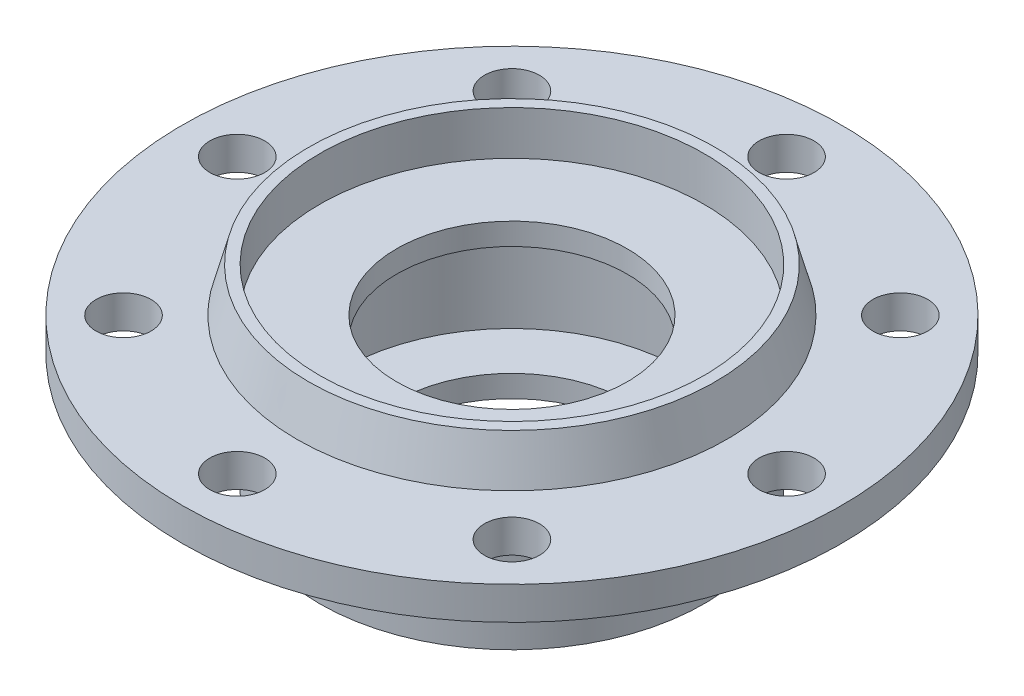
ISO-10303-21;
HEADER;
FILE_DESCRIPTION(('STEP AP214'),'2;1');
FILE_NAME('part.step','',(''),(''),'','','');
FILE_SCHEMA(('AUTOMOTIVE_DESIGN { 1 0 10303 214 1 1 1 1 }'));
ENDSEC;
DATA;
#1=APPLICATION_CONTEXT('core data for automotive mechanical design processes');
#2=APPLICATION_PROTOCOL_DEFINITION('international standard','automotive_design',2000,#1);
#3=PRODUCT_CONTEXT('',#1,'mechanical');
#4=PRODUCT('Part','Part','',(#3));
#5=PRODUCT_RELATED_PRODUCT_CATEGORY('part','',(#4));
#6=PRODUCT_DEFINITION_FORMATION('','',#4);
#7=PRODUCT_DEFINITION_CONTEXT('part definition',#1,'design');
#8=PRODUCT_DEFINITION('design','',#6,#7);
#9=PRODUCT_DEFINITION_SHAPE('','',#8);
#10=(LENGTH_UNIT() NAMED_UNIT(*) SI_UNIT(.MILLI.,.METRE.));
#11=(NAMED_UNIT(*) PLANE_ANGLE_UNIT() SI_UNIT($,.RADIAN.));
#12=(NAMED_UNIT(*) SI_UNIT($,.STERADIAN.) SOLID_ANGLE_UNIT());
#13=UNCERTAINTY_MEASURE_WITH_UNIT(LENGTH_MEASURE(1.E-05),#10,'distance_accuracy_value','');
#14=(GEOMETRIC_REPRESENTATION_CONTEXT(3) GLOBAL_UNCERTAINTY_ASSIGNED_CONTEXT((#13)) GLOBAL_UNIT_ASSIGNED_CONTEXT((#10,
#11,#12)) REPRESENTATION_CONTEXT('',''));
#15=CARTESIAN_POINT('',(0.,0.,0.));
#16=DIRECTION('',(0.,0.,1.));
#17=DIRECTION('',(1.,0.,0.));
#18=AXIS2_PLACEMENT_3D('',#15,#16,#17);
#19=CARTESIAN_POINT('',(-68.5279187817259,64.8477157360406,0.));
#20=DIRECTION('',(0.,1.,0.));
#21=DIRECTION('',(0.,0.,1.));
#22=AXIS2_PLACEMENT_3D('',#19,#20,#21);
#23=CYLINDRICAL_SURFACE('',#22,21.);
#24=CARTESIAN_POINT('',(-68.5279187817259,25.515656182297,0.));
#25=DIRECTION('',(0.,1.,0.));
#26=DIRECTION('',(0.,0.,1.));
#27=AXIS2_PLACEMENT_3D('',#24,#25,#26);
#28=CIRCLE('',#27,21.);
#29=CARTESIAN_POINT('',(-68.5279187817259,25.515656182297,21.));
#30=VERTEX_POINT('',#29);
#31=EDGE_CURVE('E86',#30,#30,#28,.T.);
#32=ORIENTED_EDGE('',*,*,#31,.F.);
#33=EDGE_LOOP('',(#32));
#34=FACE_BOUND('',#33,.T.);
#35=CARTESIAN_POINT('',(-68.5279187817259,29.5156561822969,0.));
#36=DIRECTION('',(0.,1.,0.));
#37=DIRECTION('',(0.,0.,1.));
#38=AXIS2_PLACEMENT_3D('',#35,#36,#37);
#39=CIRCLE('',#38,21.);
#40=CARTESIAN_POINT('',(-68.5279187817259,29.5156561822969,21.));
#41=VERTEX_POINT('',#40);
#42=EDGE_CURVE('E10',#41,#41,#39,.T.);
#43=ORIENTED_EDGE('',*,*,#42,.T.);
#44=EDGE_LOOP('',(#43));
#45=FACE_BOUND('',#44,.T.);
#46=ADVANCED_FACE('F37',(#34,#45),#23,.F.);
#47=CARTESIAN_POINT('',(-47.5279187817259,29.5156561822969,0.));
#48=DIRECTION('',(0.,-1.,0.));
#49=DIRECTION('',(0.,0.,-1.));
#50=AXIS2_PLACEMENT_3D('',#47,#48,#49);
#51=PLANE('',#50);
#52=ORIENTED_EDGE('',*,*,#42,.F.);
#53=EDGE_LOOP('',(#52));
#54=FACE_BOUND('',#53,.T.);
#55=CARTESIAN_POINT('',(-68.5279187817259,29.5156561822969,0.));
#56=DIRECTION('',(0.,1.,0.));
#57=DIRECTION('',(0.,0.,1.));
#58=AXIS2_PLACEMENT_3D('',#55,#56,#57);
#59=CIRCLE('',#58,31.);
#60=CARTESIAN_POINT('',(-68.5279187817259,29.5156561822969,31.));
#61=VERTEX_POINT('',#60);
#62=EDGE_CURVE('E45',#61,#61,#59,.T.);
#63=ORIENTED_EDGE('',*,*,#62,.T.);
#64=EDGE_LOOP('',(#63));
#65=FACE_BOUND('',#64,.T.);
#66=ADVANCED_FACE('F215',(#54,#65),#51,.F.);
#67=CARTESIAN_POINT('',(-68.5279187817259,64.8477157360406,0.));
#68=DIRECTION('',(0.,1.,0.));
#69=DIRECTION('',(0.,0.,1.));
#70=AXIS2_PLACEMENT_3D('',#67,#68,#69);
#71=CYLINDRICAL_SURFACE('',#70,31.);
#72=ORIENTED_EDGE('',*,*,#62,.F.);
#73=EDGE_LOOP('',(#72));
#74=FACE_BOUND('',#73,.T.);
#75=CARTESIAN_POINT('',(-68.5279187817259,49.5156561822969,0.));
#76=DIRECTION('',(0.,1.,0.));
#77=DIRECTION('',(0.,0.,1.));
#78=AXIS2_PLACEMENT_3D('',#75,#76,#77);
#79=CIRCLE('',#78,31.);
#80=CARTESIAN_POINT('',(-68.5279187817259,49.5156561822969,31.));
#81=VERTEX_POINT('',#80);
#82=EDGE_CURVE('E51',#81,#81,#79,.T.);
#83=ORIENTED_EDGE('',*,*,#82,.T.);
#84=EDGE_LOOP('',(#83));
#85=FACE_BOUND('',#84,.T.);
#86=ADVANCED_FACE('F141',(#74,#85),#71,.F.);
#87=CARTESIAN_POINT('',(-37.5279187817259,49.5156561822969,0.));
#88=DIRECTION('',(0.,1.,0.));
#89=DIRECTION('',(0.,0.,1.));
#90=AXIS2_PLACEMENT_3D('',#87,#88,#89);
#91=PLANE('',#90);
#92=ORIENTED_EDGE('',*,*,#82,.F.);
#93=EDGE_LOOP('',(#92));
#94=FACE_BOUND('',#93,.T.);
#95=CARTESIAN_POINT('',(-68.5279187817259,49.5156561822969,0.));
#96=DIRECTION('',(0.,1.,0.));
#97=DIRECTION('',(0.,0.,1.));
#98=AXIS2_PLACEMENT_3D('',#95,#96,#97);
#99=CIRCLE('',#98,21.);
#100=CARTESIAN_POINT('',(-68.5279187817259,49.5156561822969,21.));
#101=VERTEX_POINT('',#100);
#102=EDGE_CURVE('E134',#101,#101,#99,.T.);
#103=ORIENTED_EDGE('',*,*,#102,.T.);
#104=EDGE_LOOP('',(#103));
#105=FACE_BOUND('',#104,.T.);
#106=ADVANCED_FACE('F143',(#94,#105),#91,.F.);
#107=CARTESIAN_POINT('',(-68.5279187817259,64.8477157360406,0.));
#108=DIRECTION('',(0.,1.,0.));
#109=DIRECTION('',(0.,0.,1.));
#110=AXIS2_PLACEMENT_3D('',#107,#108,#109);
#111=CYLINDRICAL_SURFACE('',#110,21.);
#112=ORIENTED_EDGE('',*,*,#102,.F.);
#113=EDGE_LOOP('',(#112));
#114=FACE_BOUND('',#113,.T.);
#115=CARTESIAN_POINT('',(-68.5279187817259,53.515656182297,0.));
#116=DIRECTION('',(0.,1.,0.));
#117=DIRECTION('',(0.,0.,1.));
#118=AXIS2_PLACEMENT_3D('',#115,#116,#117);
#119=CIRCLE('',#118,21.);
#120=CARTESIAN_POINT('',(-68.5279187817259,53.515656182297,21.));
#121=VERTEX_POINT('',#120);
#122=EDGE_CURVE('E130',#121,#121,#119,.T.);
#123=ORIENTED_EDGE('',*,*,#122,.T.);
#124=EDGE_LOOP('',(#123));
#125=FACE_BOUND('',#124,.T.);
#126=ADVANCED_FACE('F146',(#114,#125),#111,.F.);
#127=CARTESIAN_POINT('',(-47.5279187817259,53.515656182297,0.));
#128=DIRECTION('',(0.,-1.,0.));
#129=DIRECTION('',(0.,0.,-1.));
#130=AXIS2_PLACEMENT_3D('',#127,#128,#129);
#131=PLANE('',#130);
#132=ORIENTED_EDGE('',*,*,#122,.F.);
#133=EDGE_LOOP('',(#132));
#134=FACE_BOUND('',#133,.T.);
#135=CARTESIAN_POINT('',(-68.5279187817259,53.515656182297,0.));
#136=DIRECTION('',(0.,1.,0.));
#137=DIRECTION('',(0.,0.,1.));
#138=AXIS2_PLACEMENT_3D('',#135,#136,#137);
#139=CIRCLE('',#138,35.);
#140=CARTESIAN_POINT('',(-68.5279187817259,53.515656182297,35.));
#141=VERTEX_POINT('',#140);
#142=EDGE_CURVE('E126',#141,#141,#139,.T.);
#143=ORIENTED_EDGE('',*,*,#142,.T.);
#144=EDGE_LOOP('',(#143));
#145=FACE_BOUND('',#144,.T.);
#146=ADVANCED_FACE('F152',(#134,#145),#131,.F.);
#147=CARTESIAN_POINT('',(-68.5279187817259,64.8477157360406,0.));
#148=DIRECTION('',(0.,1.,0.));
#149=DIRECTION('',(0.,0.,1.));
#150=AXIS2_PLACEMENT_3D('',#147,#148,#149);
#151=CYLINDRICAL_SURFACE('',#150,35.);
#152=ORIENTED_EDGE('',*,*,#142,.F.);
#153=EDGE_LOOP('',(#152));
#154=FACE_BOUND('',#153,.T.);
#155=CARTESIAN_POINT('',(-68.5279187817259,61.515656182297,0.));
#156=DIRECTION('',(0.,1.,0.));
#157=DIRECTION('',(0.,0.,1.));
#158=AXIS2_PLACEMENT_3D('',#155,#156,#157);
#159=CIRCLE('',#158,35.);
#160=CARTESIAN_POINT('',(-68.5279187817259,61.515656182297,35.));
#161=VERTEX_POINT('',#160);
#162=EDGE_CURVE('E122',#161,#161,#159,.T.);
#163=ORIENTED_EDGE('',*,*,#162,.T.);
#164=EDGE_LOOP('',(#163));
#165=FACE_BOUND('',#164,.T.);
#166=ADVANCED_FACE('F158',(#154,#165),#151,.F.);
#167=CARTESIAN_POINT('',(-33.5279187817259,61.515656182297,0.));
#168=DIRECTION('',(0.,-1.,0.));
#169=DIRECTION('',(0.,0.,-1.));
#170=AXIS2_PLACEMENT_3D('',#167,#168,#169);
#171=PLANE('',#170);
#172=ORIENTED_EDGE('',*,*,#162,.F.);
#173=EDGE_LOOP('',(#172));
#174=FACE_BOUND('',#173,.T.);
#175=CARTESIAN_POINT('',(-68.5279187817259,61.515656182297,0.));
#176=DIRECTION('',(0.,1.,0.));
#177=DIRECTION('',(0.,0.,1.));
#178=AXIS2_PLACEMENT_3D('',#175,#176,#177);
#179=CIRCLE('',#178,37.);
#180=CARTESIAN_POINT('',(-68.5279187817259,61.515656182297,37.));
#181=VERTEX_POINT('',#180);
#182=EDGE_CURVE('E118',#181,#181,#179,.T.);
#183=ORIENTED_EDGE('',*,*,#182,.T.);
#184=EDGE_LOOP('',(#183));
#185=FACE_BOUND('',#184,.T.);
#186=ADVANCED_FACE('F164',(#174,#185),#171,.F.);
#187=CARTESIAN_POINT('',(-68.5279187817259,53.515656182297,0.));
#188=DIRECTION('',(0.,-1.,0.));
#189=DIRECTION('',(0.,0.,-1.));
#190=AXIS2_PLACEMENT_3D('',#187,#188,#189);
#191=CONICAL_SURFACE('',#190,39.143593539449,0.261799387799147);
#192=ORIENTED_EDGE('',*,*,#182,.F.);
#193=EDGE_LOOP('',(#192));
#194=FACE_BOUND('',#193,.T.);
#195=CARTESIAN_POINT('',(-68.5279187817259,53.515656182297,0.));
#196=DIRECTION('',(0.,1.,0.));
#197=DIRECTION('',(0.,0.,1.));
#198=AXIS2_PLACEMENT_3D('',#195,#196,#197);
#199=CIRCLE('',#198,39.143593539449);
#200=CARTESIAN_POINT('',(-68.5279187817259,53.515656182297,39.143593539449));
#201=VERTEX_POINT('',#200);
#202=EDGE_CURVE('E114',#201,#201,#199,.T.);
#203=ORIENTED_EDGE('',*,*,#202,.T.);
#204=EDGE_LOOP('',(#203));
#205=FACE_BOUND('',#204,.T.);
#206=ADVANCED_FACE('F170',(#194,#205),#191,.T.);
#207=CARTESIAN_POINT('',(-29.3843252422769,53.515656182297,0.));
#208=DIRECTION('',(0.,-1.,0.));
#209=DIRECTION('',(0.,0.,-1.));
#210=AXIS2_PLACEMENT_3D('',#207,#208,#209);
#211=PLANE('',#210);
#212=CARTESIAN_POINT('',(-118.527918781726,53.515656182297,0.));
#213=DIRECTION('',(0.,1.,0.));
#214=DIRECTION('',(0.,0.,1.));
#215=AXIS2_PLACEMENT_3D('',#212,#213,#214);
#216=CIRCLE('',#215,5.);
#217=CARTESIAN_POINT('',(-118.527918781726,53.515656182297,5.));
#218=VERTEX_POINT('',#217);
#219=EDGE_CURVE('E60',#218,#218,#216,.T.);
#220=ORIENTED_EDGE('',*,*,#219,.F.);
#221=EDGE_LOOP('',(#220));
#222=FACE_BOUND('',#221,.T.);
#223=CARTESIAN_POINT('',(-103.883257841053,53.515656182297,-35.3553390593274));
#224=DIRECTION('',(0.,1.,0.));
#225=DIRECTION('',(0.,0.,1.));
#226=AXIS2_PLACEMENT_3D('',#223,#224,#225);
#227=CIRCLE('',#226,5.);
#228=CARTESIAN_POINT('',(-103.883257841053,53.515656182297,-30.3553390593274));
#229=VERTEX_POINT('',#228);
#230=EDGE_CURVE('E358',#229,#229,#227,.T.);
#231=ORIENTED_EDGE('',*,*,#230,.F.);
#232=EDGE_LOOP('',(#231));
#233=FACE_BOUND('',#232,.T.);
#234=CARTESIAN_POINT('',(-68.5279187817257,53.515656182297,-50.));
#235=DIRECTION('',(0.,1.,0.));
#236=DIRECTION('',(0.,0.,1.));
#237=AXIS2_PLACEMENT_3D('',#234,#235,#236);
#238=CIRCLE('',#237,5.);
#239=CARTESIAN_POINT('',(-68.5279187817257,53.515656182297,-45.));
#240=VERTEX_POINT('',#239);
#241=EDGE_CURVE('E362',#240,#240,#238,.T.);
#242=ORIENTED_EDGE('',*,*,#241,.F.);
#243=EDGE_LOOP('',(#242));
#244=FACE_BOUND('',#243,.T.);
#245=CARTESIAN_POINT('',(-33.1725797223983,53.515656182297,-35.3553390593272));
#246=DIRECTION('',(0.,1.,0.));
#247=DIRECTION('',(0.,0.,1.));
#248=AXIS2_PLACEMENT_3D('',#245,#246,#247);
#249=CIRCLE('',#248,4.99999999999999);
#250=CARTESIAN_POINT('',(-33.1725797223983,53.515656182297,-30.3553390593272));
#251=VERTEX_POINT('',#250);
#252=EDGE_CURVE('E368',#251,#251,#249,.T.);
#253=ORIENTED_EDGE('',*,*,#252,.F.);
#254=EDGE_LOOP('',(#253));
#255=FACE_BOUND('',#254,.T.);
#256=CARTESIAN_POINT('',(-18.5279187817259,53.515656182297,3.49148133884313E-13));
#257=DIRECTION('',(0.,1.,0.));
#258=DIRECTION('',(0.,0.,1.));
#259=AXIS2_PLACEMENT_3D('',#256,#257,#258);
#260=CIRCLE('',#259,5.00000000000001);
#261=CARTESIAN_POINT('',(-18.5279187817259,53.515656182297,5.00000000000036));
#262=VERTEX_POINT('',#261);
#263=EDGE_CURVE('E372',#262,#262,#260,.T.);
#264=ORIENTED_EDGE('',*,*,#263,.F.);
#265=EDGE_LOOP('',(#264));
#266=FACE_BOUND('',#265,.T.);
#267=CARTESIAN_POINT('',(-33.1725797223988,53.515656182297,35.3553390593277));
#268=DIRECTION('',(0.,1.,0.));
#269=DIRECTION('',(0.,0.,1.));
#270=AXIS2_PLACEMENT_3D('',#267,#268,#269);
#271=CIRCLE('',#270,5.);
#272=CARTESIAN_POINT('',(-33.1725797223988,53.515656182297,40.3553390593277));
#273=VERTEX_POINT('',#272);
#274=EDGE_CURVE('E376',#273,#273,#271,.T.);
#275=ORIENTED_EDGE('',*,*,#274,.F.);
#276=EDGE_LOOP('',(#275));
#277=FACE_BOUND('',#276,.T.);
#278=CARTESIAN_POINT('',(-68.5279187817264,53.515656182297,50.));
#279=DIRECTION('',(0.,1.,0.));
#280=DIRECTION('',(0.,0.,1.));
#281=AXIS2_PLACEMENT_3D('',#278,#279,#280);
#282=CIRCLE('',#281,5.00000000000001);
#283=CARTESIAN_POINT('',(-68.5279187817264,53.515656182297,55.));
#284=VERTEX_POINT('',#283);
#285=EDGE_CURVE('E379',#284,#284,#282,.T.);
#286=ORIENTED_EDGE('',*,*,#285,.F.);
#287=EDGE_LOOP('',(#286));
#288=FACE_BOUND('',#287,.T.);
#289=CARTESIAN_POINT('',(-103.883257841054,53.515656182297,35.3553390593269));
#290=DIRECTION('',(0.,1.,0.));
#291=DIRECTION('',(0.,0.,1.));
#292=AXIS2_PLACEMENT_3D('',#289,#290,#291);
#293=CIRCLE('',#292,5.);
#294=CARTESIAN_POINT('',(-103.883257841054,53.515656182297,40.3553390593269));
#295=VERTEX_POINT('',#294);
#296=EDGE_CURVE('E100',#295,#295,#293,.T.);
#297=ORIENTED_EDGE('',*,*,#296,.F.);
#298=EDGE_LOOP('',(#297));
#299=FACE_BOUND('',#298,.T.);
#300=ORIENTED_EDGE('',*,*,#202,.F.);
#301=EDGE_LOOP('',(#300));
#302=FACE_BOUND('',#301,.T.);
#303=CARTESIAN_POINT('',(-68.5279187817259,53.515656182297,0.));
#304=DIRECTION('',(0.,1.,0.));
#305=DIRECTION('',(0.,0.,1.));
#306=AXIS2_PLACEMENT_3D('',#303,#304,#305);
#307=CIRCLE('',#306,60.);
#308=CARTESIAN_POINT('',(-68.5279187817259,53.515656182297,60.));
#309=VERTEX_POINT('',#308);
#310=EDGE_CURVE('E110',#309,#309,#307,.T.);
#311=ORIENTED_EDGE('',*,*,#310,.T.);
#312=EDGE_LOOP('',(#311));
#313=FACE_BOUND('',#312,.T.);
#314=ADVANCED_FACE('F176',(#222,#233,#244,#255,#266,#277,#288,#299,#302,#313),#211,.F.);
#315=CARTESIAN_POINT('',(-68.5279187817259,64.8477157360406,0.));
#316=DIRECTION('',(0.,1.,0.));
#317=DIRECTION('',(0.,0.,1.));
#318=AXIS2_PLACEMENT_3D('',#315,#316,#317);
#319=CYLINDRICAL_SURFACE('',#318,60.);
#320=ORIENTED_EDGE('',*,*,#310,.F.);
#321=EDGE_LOOP('',(#320));
#322=FACE_BOUND('',#321,.T.);
#323=CARTESIAN_POINT('',(-68.5279187817259,47.515656182297,0.));
#324=DIRECTION('',(0.,1.,0.));
#325=DIRECTION('',(0.,0.,1.));
#326=AXIS2_PLACEMENT_3D('',#323,#324,#325);
#327=CIRCLE('',#326,60.);
#328=CARTESIAN_POINT('',(-68.5279187817259,47.515656182297,60.));
#329=VERTEX_POINT('',#328);
#330=EDGE_CURVE('E106',#329,#329,#327,.T.);
#331=ORIENTED_EDGE('',*,*,#330,.T.);
#332=EDGE_LOOP('',(#331));
#333=FACE_BOUND('',#332,.T.);
#334=ADVANCED_FACE('F182',(#322,#333),#319,.T.);
#335=CARTESIAN_POINT('',(-8.5279187817259,47.515656182297,0.));
#336=DIRECTION('',(0.,1.,0.));
#337=DIRECTION('',(0.,0.,1.));
#338=AXIS2_PLACEMENT_3D('',#335,#336,#337);
#339=PLANE('',#338);
#340=CARTESIAN_POINT('',(-118.527918781726,47.515656182297,0.));
#341=DIRECTION('',(0.,1.,0.));
#342=DIRECTION('',(0.,0.,1.));
#343=AXIS2_PLACEMENT_3D('',#340,#341,#342);
#344=CIRCLE('',#343,5.);
#345=CARTESIAN_POINT('',(-118.527918781726,47.515656182297,5.));
#346=VERTEX_POINT('',#345);
#347=EDGE_CURVE('E40',#346,#346,#344,.T.);
#348=ORIENTED_EDGE('',*,*,#347,.T.);
#349=EDGE_LOOP('',(#348));
#350=FACE_BOUND('',#349,.T.);
#351=CARTESIAN_POINT('',(-103.883257841053,47.515656182297,-35.3553390593274));
#352=DIRECTION('',(0.,1.,0.));
#353=DIRECTION('',(0.,0.,1.));
#354=AXIS2_PLACEMENT_3D('',#351,#352,#353);
#355=CIRCLE('',#354,5.);
#356=CARTESIAN_POINT('',(-103.883257841053,47.515656182297,-30.3553390593274));
#357=VERTEX_POINT('',#356);
#358=EDGE_CURVE('E79',#357,#357,#355,.T.);
#359=ORIENTED_EDGE('',*,*,#358,.T.);
#360=EDGE_LOOP('',(#359));
#361=FACE_BOUND('',#360,.T.);
#362=CARTESIAN_POINT('',(-68.5279187817257,47.515656182297,-50.));
#363=DIRECTION('',(0.,1.,0.));
#364=DIRECTION('',(0.,0.,1.));
#365=AXIS2_PLACEMENT_3D('',#362,#363,#364);
#366=CIRCLE('',#365,5.);
#367=CARTESIAN_POINT('',(-68.5279187817257,47.515656182297,-45.));
#368=VERTEX_POINT('',#367);
#369=EDGE_CURVE('E76',#368,#368,#366,.T.);
#370=ORIENTED_EDGE('',*,*,#369,.T.);
#371=EDGE_LOOP('',(#370));
#372=FACE_BOUND('',#371,.T.);
#373=CARTESIAN_POINT('',(-33.1725797223983,47.515656182297,-35.3553390593272));
#374=DIRECTION('',(0.,1.,0.));
#375=DIRECTION('',(0.,0.,1.));
#376=AXIS2_PLACEMENT_3D('',#373,#374,#375);
#377=CIRCLE('',#376,4.99999999999999);
#378=CARTESIAN_POINT('',(-33.1725797223983,47.515656182297,-30.3553390593272));
#379=VERTEX_POINT('',#378);
#380=EDGE_CURVE('E72',#379,#379,#377,.T.);
#381=ORIENTED_EDGE('',*,*,#380,.T.);
#382=EDGE_LOOP('',(#381));
#383=FACE_BOUND('',#382,.T.);
#384=CARTESIAN_POINT('',(-18.5279187817259,47.515656182297,3.49148133884313E-13));
#385=DIRECTION('',(0.,1.,0.));
#386=DIRECTION('',(0.,0.,1.));
#387=AXIS2_PLACEMENT_3D('',#384,#385,#386);
#388=CIRCLE('',#387,5.00000000000001);
#389=CARTESIAN_POINT('',(-18.5279187817259,47.515656182297,5.00000000000036));
#390=VERTEX_POINT('',#389);
#391=EDGE_CURVE('E68',#390,#390,#388,.T.);
#392=ORIENTED_EDGE('',*,*,#391,.T.);
#393=EDGE_LOOP('',(#392));
#394=FACE_BOUND('',#393,.T.);
#395=CARTESIAN_POINT('',(-33.1725797223988,47.515656182297,35.3553390593277));
#396=DIRECTION('',(0.,1.,0.));
#397=DIRECTION('',(0.,0.,1.));
#398=AXIS2_PLACEMENT_3D('',#395,#396,#397);
#399=CIRCLE('',#398,5.);
#400=CARTESIAN_POINT('',(-33.1725797223988,47.515656182297,40.3553390593277));
#401=VERTEX_POINT('',#400);
#402=EDGE_CURVE('E64',#401,#401,#399,.T.);
#403=ORIENTED_EDGE('',*,*,#402,.T.);
#404=EDGE_LOOP('',(#403));
#405=FACE_BOUND('',#404,.T.);
#406=CARTESIAN_POINT('',(-68.5279187817264,47.515656182297,50.));
#407=DIRECTION('',(0.,1.,0.));
#408=DIRECTION('',(0.,0.,1.));
#409=AXIS2_PLACEMENT_3D('',#406,#407,#408);
#410=CIRCLE('',#409,5.00000000000001);
#411=CARTESIAN_POINT('',(-68.5279187817264,47.515656182297,55.));
#412=VERTEX_POINT('',#411);
#413=EDGE_CURVE('E59',#412,#412,#410,.T.);
#414=ORIENTED_EDGE('',*,*,#413,.T.);
#415=EDGE_LOOP('',(#414));
#416=FACE_BOUND('',#415,.T.);
#417=CARTESIAN_POINT('',(-103.883257841054,47.515656182297,35.3553390593269));
#418=DIRECTION('',(0.,1.,0.));
#419=DIRECTION('',(0.,0.,1.));
#420=AXIS2_PLACEMENT_3D('',#417,#418,#419);
#421=CIRCLE('',#420,5.);
#422=CARTESIAN_POINT('',(-103.883257841054,47.515656182297,40.3553390593269));
#423=VERTEX_POINT('',#422);
#424=EDGE_CURVE('E55',#423,#423,#421,.T.);
#425=ORIENTED_EDGE('',*,*,#424,.T.);
#426=EDGE_LOOP('',(#425));
#427=FACE_BOUND('',#426,.T.);
#428=ORIENTED_EDGE('',*,*,#330,.F.);
#429=EDGE_LOOP('',(#428));
#430=FACE_BOUND('',#429,.T.);
#431=CARTESIAN_POINT('',(-68.5279187817259,47.515656182297,0.));
#432=DIRECTION('',(0.,1.,0.));
#433=DIRECTION('',(0.,0.,1.));
#434=AXIS2_PLACEMENT_3D('',#431,#432,#433);
#435=CIRCLE('',#434,35.);
#436=CARTESIAN_POINT('',(-68.5279187817259,47.515656182297,35.));
#437=VERTEX_POINT('',#436);
#438=EDGE_CURVE('E97',#437,#437,#435,.T.);
#439=ORIENTED_EDGE('',*,*,#438,.T.);
#440=EDGE_LOOP('',(#439));
#441=FACE_BOUND('',#440,.T.);
#442=ADVANCED_FACE('F189',(#350,#361,#372,#383,#394,#405,#416,#427,#430,#441),#339,.F.);
#443=CARTESIAN_POINT('',(-68.5279187817259,64.8477157360406,0.));
#444=DIRECTION('',(0.,1.,0.));
#445=DIRECTION('',(0.,0.,1.));
#446=AXIS2_PLACEMENT_3D('',#443,#444,#445);
#447=CYLINDRICAL_SURFACE('',#446,35.);
#448=ORIENTED_EDGE('',*,*,#438,.F.);
#449=EDGE_LOOP('',(#448));
#450=FACE_BOUND('',#449,.T.);
#451=CARTESIAN_POINT('',(-68.5279187817259,25.515656182297,0.));
#452=DIRECTION('',(0.,1.,0.));
#453=DIRECTION('',(0.,0.,1.));
#454=AXIS2_PLACEMENT_3D('',#451,#452,#453);
#455=CIRCLE('',#454,35.);
#456=CARTESIAN_POINT('',(-68.5279187817259,25.515656182297,35.));
#457=VERTEX_POINT('',#456);
#458=EDGE_CURVE('E91',#457,#457,#455,.T.);
#459=ORIENTED_EDGE('',*,*,#458,.T.);
#460=EDGE_LOOP('',(#459));
#461=FACE_BOUND('',#460,.T.);
#462=ADVANCED_FACE('F195',(#450,#461),#447,.T.);
#463=CARTESIAN_POINT('',(-33.5279187817259,25.515656182297,0.));
#464=DIRECTION('',(0.,1.,0.));
#465=DIRECTION('',(0.,0.,1.));
#466=AXIS2_PLACEMENT_3D('',#463,#464,#465);
#467=PLANE('',#466);
#468=ORIENTED_EDGE('',*,*,#458,.F.);
#469=EDGE_LOOP('',(#468));
#470=FACE_BOUND('',#469,.T.);
#471=ORIENTED_EDGE('',*,*,#31,.T.);
#472=EDGE_LOOP('',(#471));
#473=FACE_BOUND('',#472,.T.);
#474=ADVANCED_FACE('F201',(#470,#473),#467,.F.);
#475=CARTESIAN_POINT('',(-103.883257841054,43.515656182297,35.3553390593269));
#476=DIRECTION('',(0.,1.,0.));
#477=DIRECTION('',(0.,0.,1.));
#478=AXIS2_PLACEMENT_3D('',#475,#476,#477);
#479=CYLINDRICAL_SURFACE('',#478,5.);
#480=ORIENTED_EDGE('',*,*,#296,.T.);
#481=EDGE_LOOP('',(#480));
#482=FACE_BOUND('',#481,.T.);
#483=ORIENTED_EDGE('',*,*,#424,.F.);
#484=EDGE_LOOP('',(#483));
#485=FACE_BOUND('',#484,.T.);
#486=ADVANCED_FACE('F206',(#482,#485),#479,.F.);
#487=CARTESIAN_POINT('',(-68.5279187817264,43.515656182297,50.));
#488=DIRECTION('',(0.,1.,0.));
#489=DIRECTION('',(0.,0.,1.));
#490=AXIS2_PLACEMENT_3D('',#487,#488,#489);
#491=CYLINDRICAL_SURFACE('',#490,5.00000000000001);
#492=ORIENTED_EDGE('',*,*,#285,.T.);
#493=EDGE_LOOP('',(#492));
#494=FACE_BOUND('',#493,.T.);
#495=ORIENTED_EDGE('',*,*,#413,.F.);
#496=EDGE_LOOP('',(#495));
#497=FACE_BOUND('',#496,.T.);
#498=ADVANCED_FACE('F211',(#494,#497),#491,.F.);
#499=CARTESIAN_POINT('',(-33.1725797223988,43.515656182297,35.3553390593277));
#500=DIRECTION('',(0.,1.,0.));
#501=DIRECTION('',(0.,0.,1.));
#502=AXIS2_PLACEMENT_3D('',#499,#500,#501);
#503=CYLINDRICAL_SURFACE('',#502,5.);
#504=ORIENTED_EDGE('',*,*,#274,.T.);
#505=EDGE_LOOP('',(#504));
#506=FACE_BOUND('',#505,.T.);
#507=ORIENTED_EDGE('',*,*,#402,.F.);
#508=EDGE_LOOP('',(#507));
#509=FACE_BOUND('',#508,.T.);
#510=ADVANCED_FACE('F290',(#506,#509),#503,.F.);
#511=CARTESIAN_POINT('',(-18.5279187817259,43.515656182297,3.49148133884313E-13));
#512=DIRECTION('',(0.,1.,0.));
#513=DIRECTION('',(0.,0.,1.));
#514=AXIS2_PLACEMENT_3D('',#511,#512,#513);
#515=CYLINDRICAL_SURFACE('',#514,5.00000000000001);
#516=ORIENTED_EDGE('',*,*,#263,.T.);
#517=EDGE_LOOP('',(#516));
#518=FACE_BOUND('',#517,.T.);
#519=ORIENTED_EDGE('',*,*,#391,.F.);
#520=EDGE_LOOP('',(#519));
#521=FACE_BOUND('',#520,.T.);
#522=ADVANCED_FACE('F299',(#518,#521),#515,.F.);
#523=CARTESIAN_POINT('',(-33.1725797223983,43.515656182297,-35.3553390593272));
#524=DIRECTION('',(0.,1.,0.));
#525=DIRECTION('',(0.,0.,1.));
#526=AXIS2_PLACEMENT_3D('',#523,#524,#525);
#527=CYLINDRICAL_SURFACE('',#526,4.99999999999999);
#528=ORIENTED_EDGE('',*,*,#252,.T.);
#529=EDGE_LOOP('',(#528));
#530=FACE_BOUND('',#529,.T.);
#531=ORIENTED_EDGE('',*,*,#380,.F.);
#532=EDGE_LOOP('',(#531));
#533=FACE_BOUND('',#532,.T.);
#534=ADVANCED_FACE('F308',(#530,#533),#527,.F.);
#535=CARTESIAN_POINT('',(-68.5279187817257,43.515656182297,-50.));
#536=DIRECTION('',(0.,1.,0.));
#537=DIRECTION('',(0.,0.,1.));
#538=AXIS2_PLACEMENT_3D('',#535,#536,#537);
#539=CYLINDRICAL_SURFACE('',#538,5.);
#540=ORIENTED_EDGE('',*,*,#241,.T.);
#541=EDGE_LOOP('',(#540));
#542=FACE_BOUND('',#541,.T.);
#543=ORIENTED_EDGE('',*,*,#369,.F.);
#544=EDGE_LOOP('',(#543));
#545=FACE_BOUND('',#544,.T.);
#546=ADVANCED_FACE('F317',(#542,#545),#539,.F.);
#547=CARTESIAN_POINT('',(-103.883257841053,43.515656182297,-35.3553390593274));
#548=DIRECTION('',(0.,1.,0.));
#549=DIRECTION('',(0.,0.,1.));
#550=AXIS2_PLACEMENT_3D('',#547,#548,#549);
#551=CYLINDRICAL_SURFACE('',#550,5.);
#552=ORIENTED_EDGE('',*,*,#230,.T.);
#553=EDGE_LOOP('',(#552));
#554=FACE_BOUND('',#553,.T.);
#555=ORIENTED_EDGE('',*,*,#358,.F.);
#556=EDGE_LOOP('',(#555));
#557=FACE_BOUND('',#556,.T.);
#558=ADVANCED_FACE('F326',(#554,#557),#551,.F.);
#559=CARTESIAN_POINT('',(-118.527918781726,43.515656182297,0.));
#560=DIRECTION('',(0.,1.,0.));
#561=DIRECTION('',(0.,0.,1.));
#562=AXIS2_PLACEMENT_3D('',#559,#560,#561);
#563=CYLINDRICAL_SURFACE('',#562,5.);
#564=ORIENTED_EDGE('',*,*,#219,.T.);
#565=EDGE_LOOP('',(#564));
#566=FACE_BOUND('',#565,.T.);
#567=ORIENTED_EDGE('',*,*,#347,.F.);
#568=EDGE_LOOP('',(#567));
#569=FACE_BOUND('',#568,.T.);
#570=ADVANCED_FACE('F335',(#566,#569),#563,.F.);
#571=CLOSED_SHELL('',(#46,#66,#86,#106,#126,#146,#166,#186,#206,#314,#334,#442,#462,#474,#486,
#498,#510,#522,#534,#546,#558,#570));
#572=MANIFOLD_SOLID_BREP('B2',#571);
#573=ADVANCED_BREP_SHAPE_REPRESENTATION('',(#18,#572),#14);
#574=SHAPE_DEFINITION_REPRESENTATION(#9,#573);
ENDSEC;
END-ISO-10303-21;
